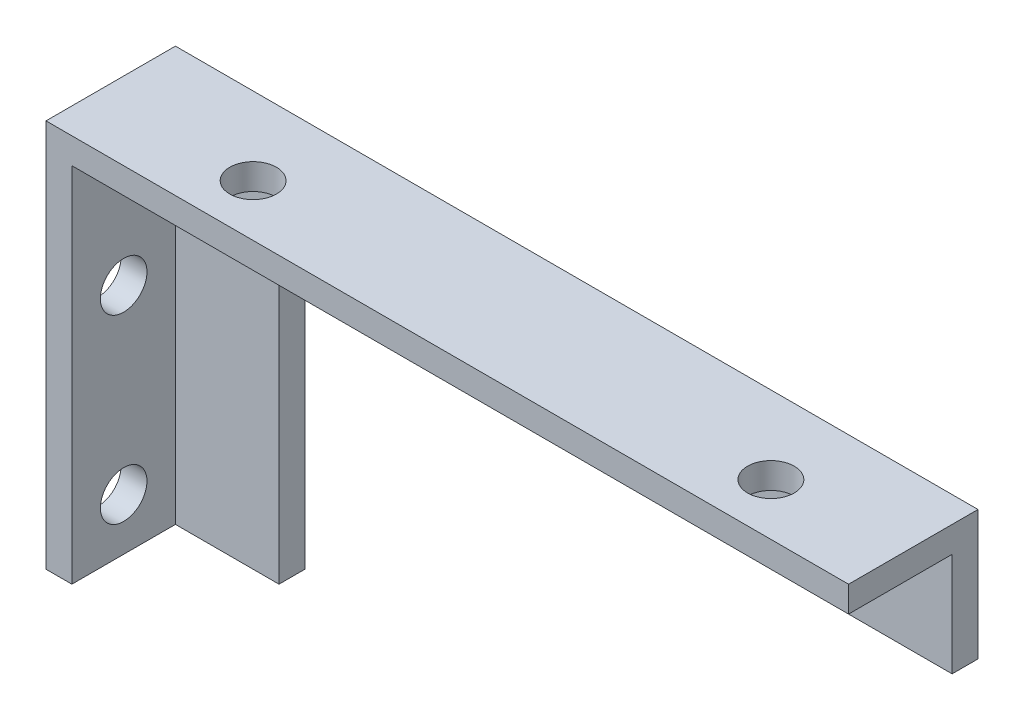
ISO-10303-21;
HEADER;
FILE_DESCRIPTION(('STEP AP214'),'2;1');
FILE_NAME('part.step','',(''),(''),'','','');
FILE_SCHEMA(('AUTOMOTIVE_DESIGN { 1 0 10303 214 1 1 1 1 }'));
ENDSEC;
DATA;
#1=APPLICATION_CONTEXT('core data for automotive mechanical design processes');
#2=APPLICATION_PROTOCOL_DEFINITION('international standard','automotive_design',2000,#1);
#3=PRODUCT_CONTEXT('',#1,'mechanical');
#4=PRODUCT('Part','Part','',(#3));
#5=PRODUCT_RELATED_PRODUCT_CATEGORY('part','',(#4));
#6=PRODUCT_DEFINITION_FORMATION('','',#4);
#7=PRODUCT_DEFINITION_CONTEXT('part definition',#1,'design');
#8=PRODUCT_DEFINITION('design','',#6,#7);
#9=PRODUCT_DEFINITION_SHAPE('','',#8);
#10=(LENGTH_UNIT() NAMED_UNIT(*) SI_UNIT(.MILLI.,.METRE.));
#11=(NAMED_UNIT(*) PLANE_ANGLE_UNIT() SI_UNIT($,.RADIAN.));
#12=(NAMED_UNIT(*) SI_UNIT($,.STERADIAN.) SOLID_ANGLE_UNIT());
#13=UNCERTAINTY_MEASURE_WITH_UNIT(LENGTH_MEASURE(1.E-05),#10,'distance_accuracy_value','');
#14=(GEOMETRIC_REPRESENTATION_CONTEXT(3) GLOBAL_UNCERTAINTY_ASSIGNED_CONTEXT((#13)) GLOBAL_UNIT_ASSIGNED_CONTEXT((#10,
#11,#12)) REPRESENTATION_CONTEXT('',''));
#15=CARTESIAN_POINT('',(0.,0.,0.));
#16=DIRECTION('',(0.,0.,1.));
#17=DIRECTION('',(1.,0.,0.));
#18=AXIS2_PLACEMENT_3D('',#15,#16,#17);
#19=CARTESIAN_POINT('',(5.,-5.,5.));
#20=DIRECTION('',(-1.,0.,0.));
#21=DIRECTION('',(0.,-1.,0.));
#22=AXIS2_PLACEMENT_3D('',#19,#20,#21);
#23=PLANE('',#22);
#24=DIRECTION('',(0.,1.,0.));
#25=VECTOR('',#24,1.);
#26=CARTESIAN_POINT('',(5.,0.,1.));
#27=LINE('',#26,#25);
#28=CARTESIAN_POINT('',(5.,-15.,1.));
#29=VERTEX_POINT('',#28);
#30=CARTESIAN_POINT('',(5.,-5.,1.));
#31=VERTEX_POINT('',#30);
#32=EDGE_CURVE('E144',#29,#31,#27,.T.);
#33=ORIENTED_EDGE('',*,*,#32,.F.);
#34=DIRECTION('',(0.,0.,-1.));
#35=VECTOR('',#34,1.);
#36=CARTESIAN_POINT('',(5.,-15.,5.));
#37=LINE('',#36,#35);
#38=CARTESIAN_POINT('',(5.,-15.,0.));
#39=VERTEX_POINT('',#38);
#40=EDGE_CURVE('E47',#29,#39,#37,.T.);
#41=ORIENTED_EDGE('',*,*,#40,.T.);
#42=DIRECTION('',(0.,1.,0.));
#43=VECTOR('',#42,1.);
#44=CARTESIAN_POINT('',(5.,-5.,0.));
#45=LINE('',#44,#43);
#46=CARTESIAN_POINT('',(5.,-5.,0.));
#47=VERTEX_POINT('',#46);
#48=EDGE_CURVE('E184',#39,#47,#45,.T.);
#49=ORIENTED_EDGE('',*,*,#48,.T.);
#50=DIRECTION('',(0.,0.,-1.));
#51=VECTOR('',#50,1.);
#52=CARTESIAN_POINT('',(5.,-5.,5.));
#53=LINE('',#52,#51);
#54=EDGE_CURVE('E205',#31,#47,#53,.T.);
#55=ORIENTED_EDGE('',*,*,#54,.F.);
#56=EDGE_LOOP('',(#33,#41,#49,#55));
#57=FACE_BOUND('',#56,.T.);
#58=ADVANCED_FACE('F38',(#57),#23,.F.);
#59=CARTESIAN_POINT('',(31.,-5.,5.));
#60=DIRECTION('',(0.,1.,0.));
#61=DIRECTION('',(-1.,0.,0.));
#62=AXIS2_PLACEMENT_3D('',#59,#60,#61);
#63=PLANE('',#62);
#64=DIRECTION('',(1.,0.,0.));
#65=VECTOR('',#64,1.);
#66=CARTESIAN_POINT('',(0.,-5.00000000000001,1.));
#67=LINE('',#66,#65);
#68=CARTESIAN_POINT('',(31.,-5.,1.));
#69=VERTEX_POINT('',#68);
#70=EDGE_CURVE('E150',#31,#69,#67,.T.);
#71=ORIENTED_EDGE('',*,*,#70,.F.);
#72=ORIENTED_EDGE('',*,*,#54,.T.);
#73=DIRECTION('',(1.,0.,0.));
#74=VECTOR('',#73,1.);
#75=CARTESIAN_POINT('',(31.,-5.,0.));
#76=LINE('',#75,#74);
#77=CARTESIAN_POINT('',(31.,-5.,0.));
#78=VERTEX_POINT('',#77);
#79=EDGE_CURVE('E188',#47,#78,#76,.T.);
#80=ORIENTED_EDGE('',*,*,#79,.T.);
#81=DIRECTION('',(0.,0.,-1.));
#82=VECTOR('',#81,1.);
#83=CARTESIAN_POINT('',(31.,-5.,5.));
#84=LINE('',#83,#82);
#85=EDGE_CURVE('E202',#69,#78,#84,.T.);
#86=ORIENTED_EDGE('',*,*,#85,.F.);
#87=EDGE_LOOP('',(#71,#72,#80,#86));
#88=FACE_BOUND('',#87,.T.);
#89=ADVANCED_FACE('F223',(#88),#63,.F.);
#90=CARTESIAN_POINT('',(31.,0.,5.));
#91=DIRECTION('',(-1.,0.,0.));
#92=DIRECTION('',(0.,0.,1.));
#93=AXIS2_PLACEMENT_3D('',#90,#91,#92);
#94=PLANE('',#93);
#95=DIRECTION('',(0.,0.,1.));
#96=VECTOR('',#95,1.);
#97=CARTESIAN_POINT('',(31.,-1.,1.));
#98=LINE('',#97,#96);
#99=CARTESIAN_POINT('',(31.,-1.,1.));
#100=VERTEX_POINT('',#99);
#101=CARTESIAN_POINT('',(31.,-1.,5.));
#102=VERTEX_POINT('',#101);
#103=EDGE_CURVE('E160',#100,#102,#98,.T.);
#104=ORIENTED_EDGE('',*,*,#103,.F.);
#105=DIRECTION('',(0.,1.,0.));
#106=VECTOR('',#105,1.);
#107=CARTESIAN_POINT('',(31.,0.,1.));
#108=LINE('',#107,#106);
#109=EDGE_CURVE('E127',#69,#100,#108,.T.);
#110=ORIENTED_EDGE('',*,*,#109,.F.);
#111=ORIENTED_EDGE('',*,*,#85,.T.);
#112=DIRECTION('',(0.,1.,0.));
#113=VECTOR('',#112,1.);
#114=CARTESIAN_POINT('',(31.,0.,0.));
#115=LINE('',#114,#113);
#116=CARTESIAN_POINT('',(31.,0.,0.));
#117=VERTEX_POINT('',#116);
#118=EDGE_CURVE('E192',#78,#117,#115,.T.);
#119=ORIENTED_EDGE('',*,*,#118,.T.);
#120=DIRECTION('',(0.,0.,-1.));
#121=VECTOR('',#120,1.);
#122=CARTESIAN_POINT('',(31.,0.,5.));
#123=LINE('',#122,#121);
#124=CARTESIAN_POINT('',(31.,0.,5.));
#125=VERTEX_POINT('',#124);
#126=EDGE_CURVE('E199',#125,#117,#123,.T.);
#127=ORIENTED_EDGE('',*,*,#126,.F.);
#128=DIRECTION('',(0.,1.,0.));
#129=VECTOR('',#128,1.);
#130=CARTESIAN_POINT('',(31.,0.,5.));
#131=LINE('',#130,#129);
#132=EDGE_CURVE('E171',#102,#125,#131,.T.);
#133=ORIENTED_EDGE('',*,*,#132,.F.);
#134=EDGE_LOOP('',(#104,#110,#111,#119,#127,#133));
#135=FACE_BOUND('',#134,.T.);
#136=ADVANCED_FACE('F225',(#135),#94,.F.);
#137=CARTESIAN_POINT('',(0.,0.,5.));
#138=DIRECTION('',(0.,0.,-1.));
#139=DIRECTION('',(-1.,0.,0.));
#140=AXIS2_PLACEMENT_3D('',#137,#138,#139);
#141=PLANE('',#140);
#142=DIRECTION('',(1.,0.,0.));
#143=VECTOR('',#142,1.);
#144=CARTESIAN_POINT('',(0.,-1.,5.));
#145=LINE('',#144,#143);
#146=CARTESIAN_POINT('',(1.,-1.,5.));
#147=VERTEX_POINT('',#146);
#148=EDGE_CURVE('E54',#147,#102,#145,.T.);
#149=ORIENTED_EDGE('',*,*,#148,.T.);
#150=ORIENTED_EDGE('',*,*,#132,.T.);
#151=DIRECTION('',(-1.,0.,0.));
#152=VECTOR('',#151,1.);
#153=CARTESIAN_POINT('',(0.,0.,5.));
#154=LINE('',#153,#152);
#155=CARTESIAN_POINT('',(0.,0.,5.));
#156=VERTEX_POINT('',#155);
#157=EDGE_CURVE('E63',#125,#156,#154,.T.);
#158=ORIENTED_EDGE('',*,*,#157,.T.);
#159=DIRECTION('',(0.,-1.,0.));
#160=VECTOR('',#159,1.);
#161=CARTESIAN_POINT('',(0.,-15.,5.));
#162=LINE('',#161,#160);
#163=CARTESIAN_POINT('',(0.,-15.,5.));
#164=VERTEX_POINT('',#163);
#165=EDGE_CURVE('E166',#156,#164,#162,.T.);
#166=ORIENTED_EDGE('',*,*,#165,.T.);
#167=DIRECTION('',(1.,0.,0.));
#168=VECTOR('',#167,1.);
#169=CARTESIAN_POINT('',(5.,-15.,5.));
#170=LINE('',#169,#168);
#171=CARTESIAN_POINT('',(1.,-15.,5.));
#172=VERTEX_POINT('',#171);
#173=EDGE_CURVE('E95',#164,#172,#170,.T.);
#174=ORIENTED_EDGE('',*,*,#173,.T.);
#175=DIRECTION('',(0.,-1.,0.));
#176=VECTOR('',#175,1.);
#177=CARTESIAN_POINT('',(1.,0.,5.));
#178=LINE('',#177,#176);
#179=EDGE_CURVE('E137',#147,#172,#178,.T.);
#180=ORIENTED_EDGE('',*,*,#179,.F.);
#181=EDGE_LOOP('',(#149,#150,#158,#166,#174,#180));
#182=FACE_BOUND('',#181,.T.);
#183=ADVANCED_FACE('F228',(#182),#141,.F.);
#184=CARTESIAN_POINT('',(0.,-15.,5.));
#185=DIRECTION('',(1.,0.,0.));
#186=DIRECTION('',(0.,0.,-1.));
#187=AXIS2_PLACEMENT_3D('',#184,#185,#186);
#188=PLANE('',#187);
#189=CARTESIAN_POINT('',(0.,-6.,3.));
#190=DIRECTION('',(1.,0.,0.));
#191=DIRECTION('',(0.,0.,-1.));
#192=AXIS2_PLACEMENT_3D('',#189,#190,#191);
#193=CIRCLE('',#192,0.9);
#194=CARTESIAN_POINT('',(0.,-6.,2.1));
#195=VERTEX_POINT('',#194);
#196=EDGE_CURVE('E292',#195,#195,#193,.T.);
#197=ORIENTED_EDGE('',*,*,#196,.T.);
#198=EDGE_LOOP('',(#197));
#199=FACE_BOUND('',#198,.T.);
#200=CARTESIAN_POINT('',(0.,-13.,3.));
#201=DIRECTION('',(1.,0.,0.));
#202=DIRECTION('',(0.,0.,-1.));
#203=AXIS2_PLACEMENT_3D('',#200,#201,#202);
#204=CIRCLE('',#203,0.9);
#205=CARTESIAN_POINT('',(0.,-13.,2.1));
#206=VERTEX_POINT('',#205);
#207=EDGE_CURVE('E295',#206,#206,#204,.T.);
#208=ORIENTED_EDGE('',*,*,#207,.T.);
#209=EDGE_LOOP('',(#208));
#210=FACE_BOUND('',#209,.T.);
#211=DIRECTION('',(0.,-1.,0.));
#212=VECTOR('',#211,1.);
#213=CARTESIAN_POINT('',(0.,-15.,0.));
#214=LINE('',#213,#212);
#215=CARTESIAN_POINT('',(0.,0.,0.));
#216=VERTEX_POINT('',#215);
#217=CARTESIAN_POINT('',(0.,-15.,0.));
#218=VERTEX_POINT('',#217);
#219=EDGE_CURVE('E163',#216,#218,#214,.T.);
#220=ORIENTED_EDGE('',*,*,#219,.T.);
#221=DIRECTION('',(0.,0.,-1.));
#222=VECTOR('',#221,1.);
#223=CARTESIAN_POINT('',(0.,-15.,5.));
#224=LINE('',#223,#222);
#225=EDGE_CURVE('E11',#164,#218,#224,.T.);
#226=ORIENTED_EDGE('',*,*,#225,.F.);
#227=ORIENTED_EDGE('',*,*,#165,.F.);
#228=DIRECTION('',(0.,0.,-1.));
#229=VECTOR('',#228,1.);
#230=CARTESIAN_POINT('',(0.,0.,5.));
#231=LINE('',#230,#229);
#232=EDGE_CURVE('E176',#156,#216,#231,.T.);
#233=ORIENTED_EDGE('',*,*,#232,.T.);
#234=EDGE_LOOP('',(#220,#226,#227,#233));
#235=FACE_BOUND('',#234,.T.);
#236=ADVANCED_FACE('F40',(#199,#210,#235),#188,.F.);
#237=CARTESIAN_POINT('',(5.,-15.,5.));
#238=DIRECTION('',(0.,1.,0.));
#239=DIRECTION('',(0.,0.,1.));
#240=AXIS2_PLACEMENT_3D('',#237,#238,#239);
#241=PLANE('',#240);
#242=DIRECTION('',(1.,0.,0.));
#243=VECTOR('',#242,1.);
#244=CARTESIAN_POINT('',(0.,-15.,1.));
#245=LINE('',#244,#243);
#246=CARTESIAN_POINT('',(1.,-15.,1.));
#247=VERTEX_POINT('',#246);
#248=EDGE_CURVE('E141',#247,#29,#245,.T.);
#249=ORIENTED_EDGE('',*,*,#248,.F.);
#250=DIRECTION('',(0.,0.,1.));
#251=VECTOR('',#250,1.);
#252=CARTESIAN_POINT('',(1.,-15.,1.));
#253=LINE('',#252,#251);
#254=EDGE_CURVE('E126',#247,#172,#253,.T.);
#255=ORIENTED_EDGE('',*,*,#254,.T.);
#256=ORIENTED_EDGE('',*,*,#173,.F.);
#257=ORIENTED_EDGE('',*,*,#225,.T.);
#258=DIRECTION('',(1.,0.,0.));
#259=VECTOR('',#258,1.);
#260=CARTESIAN_POINT('',(5.,-15.,0.));
#261=LINE('',#260,#259);
#262=EDGE_CURVE('E180',#218,#39,#261,.T.);
#263=ORIENTED_EDGE('',*,*,#262,.T.);
#264=ORIENTED_EDGE('',*,*,#40,.F.);
#265=EDGE_LOOP('',(#249,#255,#256,#257,#263,#264));
#266=FACE_BOUND('',#265,.T.);
#267=ADVANCED_FACE('F214',(#266),#241,.F.);
#268=CARTESIAN_POINT('',(0.,0.,5.));
#269=DIRECTION('',(0.,-1.,0.));
#270=DIRECTION('',(0.,0.,-1.));
#271=AXIS2_PLACEMENT_3D('',#268,#269,#270);
#272=PLANE('',#271);
#273=CARTESIAN_POINT('',(26.,0.,3.));
#274=DIRECTION('',(0.,-1.,0.));
#275=DIRECTION('',(0.,0.,-1.));
#276=AXIS2_PLACEMENT_3D('',#273,#274,#275);
#277=CIRCLE('',#276,0.9);
#278=CARTESIAN_POINT('',(26.,0.,2.1));
#279=VERTEX_POINT('',#278);
#280=EDGE_CURVE('E157',#279,#279,#277,.T.);
#281=ORIENTED_EDGE('',*,*,#280,.T.);
#282=EDGE_LOOP('',(#281));
#283=FACE_BOUND('',#282,.T.);
#284=CARTESIAN_POINT('',(6.,0.,3.));
#285=DIRECTION('',(0.,-1.,0.));
#286=DIRECTION('',(0.,0.,-1.));
#287=AXIS2_PLACEMENT_3D('',#284,#285,#286);
#288=CIRCLE('',#287,0.9);
#289=CARTESIAN_POINT('',(6.,0.,2.1));
#290=VERTEX_POINT('',#289);
#291=EDGE_CURVE('E308',#290,#290,#288,.T.);
#292=ORIENTED_EDGE('',*,*,#291,.T.);
#293=EDGE_LOOP('',(#292));
#294=FACE_BOUND('',#293,.T.);
#295=DIRECTION('',(-1.,0.,0.));
#296=VECTOR('',#295,1.);
#297=CARTESIAN_POINT('',(0.,0.,0.));
#298=LINE('',#297,#296);
#299=EDGE_CURVE('E89',#117,#216,#298,.T.);
#300=ORIENTED_EDGE('',*,*,#299,.T.);
#301=ORIENTED_EDGE('',*,*,#232,.F.);
#302=ORIENTED_EDGE('',*,*,#157,.F.);
#303=ORIENTED_EDGE('',*,*,#126,.T.);
#304=EDGE_LOOP('',(#300,#301,#302,#303));
#305=FACE_BOUND('',#304,.T.);
#306=ADVANCED_FACE('F231',(#283,#294,#305),#272,.F.);
#307=CARTESIAN_POINT('',(0.,0.,0.));
#308=DIRECTION('',(0.,0.,-1.));
#309=DIRECTION('',(-1.,0.,0.));
#310=AXIS2_PLACEMENT_3D('',#307,#308,#309);
#311=PLANE('',#310);
#312=ORIENTED_EDGE('',*,*,#219,.F.);
#313=ORIENTED_EDGE('',*,*,#299,.F.);
#314=ORIENTED_EDGE('',*,*,#118,.F.);
#315=ORIENTED_EDGE('',*,*,#79,.F.);
#316=ORIENTED_EDGE('',*,*,#48,.F.);
#317=ORIENTED_EDGE('',*,*,#262,.F.);
#318=EDGE_LOOP('',(#312,#313,#314,#315,#316,#317));
#319=FACE_BOUND('',#318,.T.);
#320=ADVANCED_FACE('F218',(#319),#311,.T.);
#321=CARTESIAN_POINT('',(0.,-1.,1.));
#322=DIRECTION('',(0.,-1.,0.));
#323=DIRECTION('',(0.,0.,-1.));
#324=AXIS2_PLACEMENT_3D('',#321,#322,#323);
#325=PLANE('',#324);
#326=CARTESIAN_POINT('',(26.,-1.,3.));
#327=DIRECTION('',(0.,-1.,0.));
#328=DIRECTION('',(0.,0.,-1.));
#329=AXIS2_PLACEMENT_3D('',#326,#327,#328);
#330=CIRCLE('',#329,0.9);
#331=CARTESIAN_POINT('',(26.,-1.,2.1));
#332=VERTEX_POINT('',#331);
#333=EDGE_CURVE('E300',#332,#332,#330,.T.);
#334=ORIENTED_EDGE('',*,*,#333,.F.);
#335=EDGE_LOOP('',(#334));
#336=FACE_BOUND('',#335,.T.);
#337=CARTESIAN_POINT('',(6.,-1.,3.));
#338=DIRECTION('',(0.,-1.,0.));
#339=DIRECTION('',(0.,0.,-1.));
#340=AXIS2_PLACEMENT_3D('',#337,#338,#339);
#341=CIRCLE('',#340,0.9);
#342=CARTESIAN_POINT('',(6.,-1.,2.1));
#343=VERTEX_POINT('',#342);
#344=EDGE_CURVE('E294',#343,#343,#341,.T.);
#345=ORIENTED_EDGE('',*,*,#344,.F.);
#346=EDGE_LOOP('',(#345));
#347=FACE_BOUND('',#346,.T.);
#348=ORIENTED_EDGE('',*,*,#148,.F.);
#349=DIRECTION('',(0.,0.,1.));
#350=VECTOR('',#349,1.);
#351=CARTESIAN_POINT('',(1.,-1.,1.));
#352=LINE('',#351,#350);
#353=CARTESIAN_POINT('',(1.,-1.,1.));
#354=VERTEX_POINT('',#353);
#355=EDGE_CURVE('E117',#354,#147,#352,.T.);
#356=ORIENTED_EDGE('',*,*,#355,.F.);
#357=DIRECTION('',(1.,0.,0.));
#358=VECTOR('',#357,1.);
#359=CARTESIAN_POINT('',(0.,-1.,1.));
#360=LINE('',#359,#358);
#361=EDGE_CURVE('E120',#354,#100,#360,.T.);
#362=ORIENTED_EDGE('',*,*,#361,.T.);
#363=ORIENTED_EDGE('',*,*,#103,.T.);
#364=EDGE_LOOP('',(#348,#356,#362,#363));
#365=FACE_BOUND('',#364,.T.);
#366=ADVANCED_FACE('F119',(#336,#347,#365),#325,.T.);
#367=CARTESIAN_POINT('',(1.,0.,1.));
#368=DIRECTION('',(-1.,0.,0.));
#369=DIRECTION('',(0.,0.,1.));
#370=AXIS2_PLACEMENT_3D('',#367,#368,#369);
#371=PLANE('',#370);
#372=CARTESIAN_POINT('',(1.,-6.,3.));
#373=DIRECTION('',(1.,0.,0.));
#374=DIRECTION('',(0.,0.,-1.));
#375=AXIS2_PLACEMENT_3D('',#372,#373,#374);
#376=CIRCLE('',#375,0.9);
#377=CARTESIAN_POINT('',(1.,-6.,2.1));
#378=VERTEX_POINT('',#377);
#379=EDGE_CURVE('E289',#378,#378,#376,.T.);
#380=ORIENTED_EDGE('',*,*,#379,.F.);
#381=EDGE_LOOP('',(#380));
#382=FACE_BOUND('',#381,.T.);
#383=CARTESIAN_POINT('',(1.,-13.,3.));
#384=DIRECTION('',(1.,0.,0.));
#385=DIRECTION('',(0.,0.,-1.));
#386=AXIS2_PLACEMENT_3D('',#383,#384,#385);
#387=CIRCLE('',#386,0.9);
#388=CARTESIAN_POINT('',(1.,-13.,2.1));
#389=VERTEX_POINT('',#388);
#390=EDGE_CURVE('E320',#389,#389,#387,.T.);
#391=ORIENTED_EDGE('',*,*,#390,.F.);
#392=EDGE_LOOP('',(#391));
#393=FACE_BOUND('',#392,.T.);
#394=ORIENTED_EDGE('',*,*,#179,.T.);
#395=ORIENTED_EDGE('',*,*,#254,.F.);
#396=DIRECTION('',(0.,-1.,0.));
#397=VECTOR('',#396,1.);
#398=CARTESIAN_POINT('',(1.,0.,1.));
#399=LINE('',#398,#397);
#400=EDGE_CURVE('E132',#354,#247,#399,.T.);
#401=ORIENTED_EDGE('',*,*,#400,.F.);
#402=ORIENTED_EDGE('',*,*,#355,.T.);
#403=EDGE_LOOP('',(#394,#395,#401,#402));
#404=FACE_BOUND('',#403,.T.);
#405=ADVANCED_FACE('F139',(#382,#393,#404),#371,.F.);
#406=CARTESIAN_POINT('',(0.,0.,1.));
#407=DIRECTION('',(0.,0.,1.));
#408=DIRECTION('',(1.,0.,0.));
#409=AXIS2_PLACEMENT_3D('',#406,#407,#408);
#410=PLANE('',#409);
#411=ORIENTED_EDGE('',*,*,#361,.F.);
#412=ORIENTED_EDGE('',*,*,#400,.T.);
#413=ORIENTED_EDGE('',*,*,#248,.T.);
#414=ORIENTED_EDGE('',*,*,#32,.T.);
#415=ORIENTED_EDGE('',*,*,#70,.T.);
#416=ORIENTED_EDGE('',*,*,#109,.T.);
#417=EDGE_LOOP('',(#411,#412,#413,#414,#415,#416));
#418=FACE_BOUND('',#417,.T.);
#419=ADVANCED_FACE('F131',(#418),#410,.T.);
#420=CARTESIAN_POINT('',(6.,9.,3.));
#421=DIRECTION('',(0.,-1.,0.));
#422=DIRECTION('',(0.,0.,-1.));
#423=AXIS2_PLACEMENT_3D('',#420,#421,#422);
#424=CYLINDRICAL_SURFACE('',#423,0.9);
#425=ORIENTED_EDGE('',*,*,#344,.T.);
#426=EDGE_LOOP('',(#425));
#427=FACE_BOUND('',#426,.T.);
#428=ORIENTED_EDGE('',*,*,#291,.F.);
#429=EDGE_LOOP('',(#428));
#430=FACE_BOUND('',#429,.T.);
#431=ADVANCED_FACE('F269',(#427,#430),#424,.F.);
#432=CARTESIAN_POINT('',(26.,9.,3.));
#433=DIRECTION('',(0.,-1.,0.));
#434=DIRECTION('',(0.,0.,-1.));
#435=AXIS2_PLACEMENT_3D('',#432,#433,#434);
#436=CYLINDRICAL_SURFACE('',#435,0.9);
#437=ORIENTED_EDGE('',*,*,#333,.T.);
#438=EDGE_LOOP('',(#437));
#439=FACE_BOUND('',#438,.T.);
#440=ORIENTED_EDGE('',*,*,#280,.F.);
#441=EDGE_LOOP('',(#440));
#442=FACE_BOUND('',#441,.T.);
#443=ADVANCED_FACE('F272',(#439,#442),#436,.F.);
#444=CARTESIAN_POINT('',(-9.,-13.,3.));
#445=DIRECTION('',(1.,0.,0.));
#446=DIRECTION('',(0.,0.,-1.));
#447=AXIS2_PLACEMENT_3D('',#444,#445,#446);
#448=CYLINDRICAL_SURFACE('',#447,0.9);
#449=ORIENTED_EDGE('',*,*,#390,.T.);
#450=EDGE_LOOP('',(#449));
#451=FACE_BOUND('',#450,.T.);
#452=ORIENTED_EDGE('',*,*,#207,.F.);
#453=EDGE_LOOP('',(#452));
#454=FACE_BOUND('',#453,.T.);
#455=ADVANCED_FACE('F276',(#451,#454),#448,.F.);
#456=CARTESIAN_POINT('',(-9.,-6.,3.));
#457=DIRECTION('',(1.,0.,0.));
#458=DIRECTION('',(0.,0.,-1.));
#459=AXIS2_PLACEMENT_3D('',#456,#457,#458);
#460=CYLINDRICAL_SURFACE('',#459,0.9);
#461=ORIENTED_EDGE('',*,*,#379,.T.);
#462=EDGE_LOOP('',(#461));
#463=FACE_BOUND('',#462,.T.);
#464=ORIENTED_EDGE('',*,*,#196,.F.);
#465=EDGE_LOOP('',(#464));
#466=FACE_BOUND('',#465,.T.);
#467=ADVANCED_FACE('F280',(#463,#466),#460,.F.);
#468=CLOSED_SHELL('',(#58,#89,#136,#183,#236,#267,#306,#320,#366,#405,#419,#431,#443,#455,#467));
#469=MANIFOLD_SOLID_BREP('B2',#468);
#470=ADVANCED_BREP_SHAPE_REPRESENTATION('',(#18,#469),#14);
#471=SHAPE_DEFINITION_REPRESENTATION(#9,#470);
ENDSEC;
END-ISO-10303-21;
